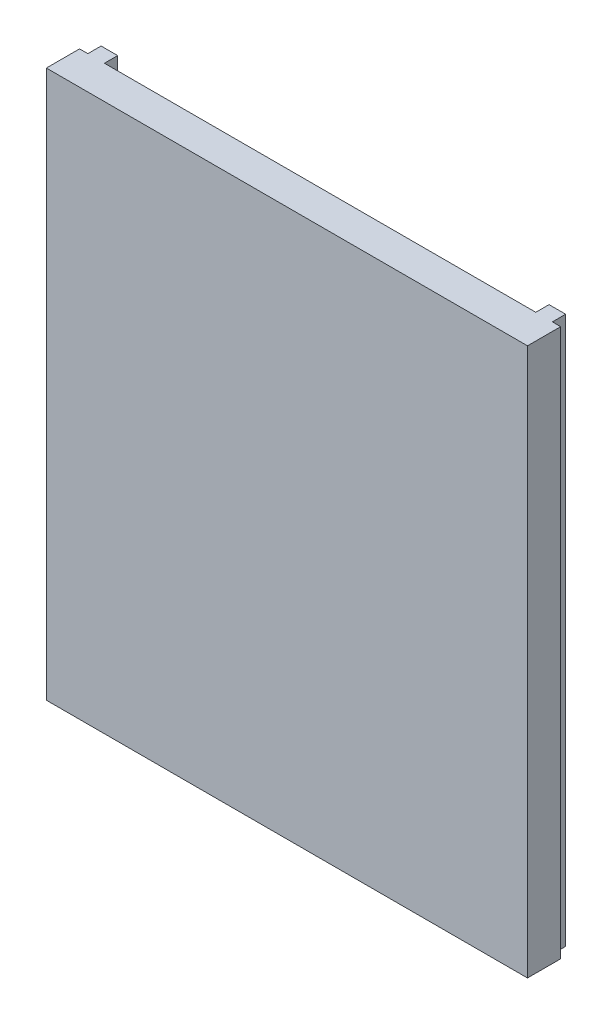
ISO-10303-21;
HEADER;
FILE_DESCRIPTION(('STEP AP214'),'2;1');
FILE_NAME('part.step','',(''),(''),'','','');
FILE_SCHEMA(('AUTOMOTIVE_DESIGN { 1 0 10303 214 1 1 1 1 }'));
ENDSEC;
DATA;
#1=APPLICATION_CONTEXT('core data for automotive mechanical design processes');
#2=APPLICATION_PROTOCOL_DEFINITION('international standard','automotive_design',2000,#1);
#3=PRODUCT_CONTEXT('',#1,'mechanical');
#4=PRODUCT('Part','Part','',(#3));
#5=PRODUCT_RELATED_PRODUCT_CATEGORY('part','',(#4));
#6=PRODUCT_DEFINITION_FORMATION('','',#4);
#7=PRODUCT_DEFINITION_CONTEXT('part definition',#1,'design');
#8=PRODUCT_DEFINITION('design','',#6,#7);
#9=PRODUCT_DEFINITION_SHAPE('','',#8);
#10=(LENGTH_UNIT() NAMED_UNIT(*) SI_UNIT(.MILLI.,.METRE.));
#11=(NAMED_UNIT(*) PLANE_ANGLE_UNIT() SI_UNIT($,.RADIAN.));
#12=(NAMED_UNIT(*) SI_UNIT($,.STERADIAN.) SOLID_ANGLE_UNIT());
#13=UNCERTAINTY_MEASURE_WITH_UNIT(LENGTH_MEASURE(1.E-05),#10,'distance_accuracy_value','');
#14=(GEOMETRIC_REPRESENTATION_CONTEXT(3) GLOBAL_UNCERTAINTY_ASSIGNED_CONTEXT((#13)) GLOBAL_UNIT_ASSIGNED_CONTEXT((#10,
#11,#12)) REPRESENTATION_CONTEXT('',''));
#15=CARTESIAN_POINT('',(0.,0.,0.));
#16=DIRECTION('',(0.,0.,1.));
#17=DIRECTION('',(1.,0.,0.));
#18=AXIS2_PLACEMENT_3D('',#15,#16,#17);
#19=CARTESIAN_POINT('',(0.,0.,1.00000000000015));
#20=DIRECTION('',(0.,0.,-1.));
#21=DIRECTION('',(-1.,0.,0.));
#22=AXIS2_PLACEMENT_3D('',#19,#20,#21);
#23=PLANE('',#22);
#24=DIRECTION('',(0.,-1.,0.));
#25=VECTOR('',#24,1.);
#26=CARTESIAN_POINT('',(-13.,-16.5,1.00000000000015));
#27=LINE('',#26,#25);
#28=CARTESIAN_POINT('',(-13.,16.5,1.00000000000015));
#29=VERTEX_POINT('',#28);
#30=CARTESIAN_POINT('',(-13.,-16.5,1.00000000000015));
#31=VERTEX_POINT('',#30);
#32=EDGE_CURVE('E61',#29,#31,#27,.T.);
#33=ORIENTED_EDGE('',*,*,#32,.F.);
#34=DIRECTION('',(-1.,0.,0.));
#35=VECTOR('',#34,1.);
#36=CARTESIAN_POINT('',(14.5,16.5,1.00000000000015));
#37=LINE('',#36,#35);
#38=CARTESIAN_POINT('',(13.,16.5,1.00000000000015));
#39=VERTEX_POINT('',#38);
#40=EDGE_CURVE('E65',#39,#29,#37,.T.);
#41=ORIENTED_EDGE('',*,*,#40,.F.);
#42=DIRECTION('',(0.,1.,0.));
#43=VECTOR('',#42,1.);
#44=CARTESIAN_POINT('',(13.,16.5,1.00000000000015));
#45=LINE('',#44,#43);
#46=CARTESIAN_POINT('',(13.,-16.5,1.00000000000015));
#47=VERTEX_POINT('',#46);
#48=EDGE_CURVE('E191',#47,#39,#45,.T.);
#49=ORIENTED_EDGE('',*,*,#48,.F.);
#50=DIRECTION('',(1.,0.,0.));
#51=VECTOR('',#50,1.);
#52=CARTESIAN_POINT('',(14.5,-16.5,1.00000000000015));
#53=LINE('',#52,#51);
#54=EDGE_CURVE('E232',#31,#47,#53,.T.);
#55=ORIENTED_EDGE('',*,*,#54,.F.);
#56=EDGE_LOOP('',(#33,#41,#49,#55));
#57=FACE_BOUND('',#56,.T.);
#58=ADVANCED_FACE('F45',(#57),#23,.T.);
#59=DIRECTION('',(0.,1.,0.));
#60=VECTOR('',#59,1.);
#61=CARTESIAN_POINT('',(-14.,-16.5,1.00000000000015));
#62=LINE('',#61,#60);
#63=CARTESIAN_POINT('',(-14.,-16.5,1.00000000000015));
#64=VERTEX_POINT('',#63);
#65=CARTESIAN_POINT('',(-14.,16.5,1.00000000000015));
#66=VERTEX_POINT('',#65);
#67=EDGE_CURVE('E156',#64,#66,#62,.T.);
#68=ORIENTED_EDGE('',*,*,#67,.F.);
#69=CARTESIAN_POINT('',(-14.5,-16.5,1.00000000000015));
#70=VERTEX_POINT('',#69);
#71=EDGE_CURVE('E212',#70,#64,#53,.T.);
#72=ORIENTED_EDGE('',*,*,#71,.F.);
#73=DIRECTION('',(0.,-1.,0.));
#74=VECTOR('',#73,1.);
#75=CARTESIAN_POINT('',(-14.5,16.5,1.00000000000015));
#76=LINE('',#75,#74);
#77=CARTESIAN_POINT('',(-14.5,16.5,1.00000000000015));
#78=VERTEX_POINT('',#77);
#79=EDGE_CURVE('E226',#78,#70,#76,.T.);
#80=ORIENTED_EDGE('',*,*,#79,.F.);
#81=EDGE_CURVE('E165',#66,#78,#37,.T.);
#82=ORIENTED_EDGE('',*,*,#81,.F.);
#83=EDGE_LOOP('',(#68,#72,#80,#82));
#84=FACE_BOUND('',#83,.T.);
#85=ADVANCED_FACE('F250',(#84),#23,.T.);
#86=CARTESIAN_POINT('',(14.5,16.5,3.00000000000015));
#87=DIRECTION('',(-1.,0.,0.));
#88=DIRECTION('',(0.,0.,1.));
#89=AXIS2_PLACEMENT_3D('',#86,#87,#88);
#90=PLANE('',#89);
#91=DIRECTION('',(0.,1.,0.));
#92=VECTOR('',#91,1.);
#93=CARTESIAN_POINT('',(14.5,16.5,1.00000000000015));
#94=LINE('',#93,#92);
#95=CARTESIAN_POINT('',(14.5,-16.5,1.00000000000015));
#96=VERTEX_POINT('',#95);
#97=CARTESIAN_POINT('',(14.5,16.5,1.00000000000015));
#98=VERTEX_POINT('',#97);
#99=EDGE_CURVE('E160',#96,#98,#94,.T.);
#100=ORIENTED_EDGE('',*,*,#99,.T.);
#101=DIRECTION('',(0.,0.,-1.));
#102=VECTOR('',#101,1.);
#103=CARTESIAN_POINT('',(14.5,16.5,3.00000000000015));
#104=LINE('',#103,#102);
#105=CARTESIAN_POINT('',(14.5,16.5,3.00000000000015));
#106=VERTEX_POINT('',#105);
#107=EDGE_CURVE('E11',#106,#98,#104,.T.);
#108=ORIENTED_EDGE('',*,*,#107,.F.);
#109=DIRECTION('',(0.,1.,0.));
#110=VECTOR('',#109,1.);
#111=CARTESIAN_POINT('',(14.5,16.5,3.00000000000015));
#112=LINE('',#111,#110);
#113=CARTESIAN_POINT('',(14.5,-16.5,3.00000000000015));
#114=VERTEX_POINT('',#113);
#115=EDGE_CURVE('E207',#114,#106,#112,.T.);
#116=ORIENTED_EDGE('',*,*,#115,.F.);
#117=DIRECTION('',(0.,0.,-1.));
#118=VECTOR('',#117,1.);
#119=CARTESIAN_POINT('',(14.5,-16.5,3.00000000000015));
#120=LINE('',#119,#118);
#121=EDGE_CURVE('E220',#114,#96,#120,.T.);
#122=ORIENTED_EDGE('',*,*,#121,.T.);
#123=EDGE_LOOP('',(#100,#108,#116,#122));
#124=FACE_BOUND('',#123,.T.);
#125=ADVANCED_FACE('F47',(#124),#90,.F.);
#126=CARTESIAN_POINT('',(14.5,16.5,3.00000000000015));
#127=DIRECTION('',(0.,-1.,0.));
#128=DIRECTION('',(0.,0.,-1.));
#129=AXIS2_PLACEMENT_3D('',#126,#127,#128);
#130=PLANE('',#129);
#131=CARTESIAN_POINT('',(14.,16.5,1.00000000000015));
#132=VERTEX_POINT('',#131);
#133=EDGE_CURVE('E222',#98,#132,#37,.T.);
#134=ORIENTED_EDGE('',*,*,#133,.T.);
#135=DIRECTION('',(0.,0.,1.));
#136=VECTOR('',#135,1.);
#137=CARTESIAN_POINT('',(14.,16.5,0.20000000000015));
#138=LINE('',#137,#136);
#139=CARTESIAN_POINT('',(14.,16.5,0.20000000000015));
#140=VERTEX_POINT('',#139);
#141=EDGE_CURVE('E174',#140,#132,#138,.T.);
#142=ORIENTED_EDGE('',*,*,#141,.F.);
#143=DIRECTION('',(1.,0.,0.));
#144=VECTOR('',#143,1.);
#145=CARTESIAN_POINT('',(13.,16.5,0.20000000000015));
#146=LINE('',#145,#144);
#147=CARTESIAN_POINT('',(13.,16.5,0.20000000000015));
#148=VERTEX_POINT('',#147);
#149=EDGE_CURVE('E201',#148,#140,#146,.T.);
#150=ORIENTED_EDGE('',*,*,#149,.F.);
#151=DIRECTION('',(0.,0.,1.));
#152=VECTOR('',#151,1.);
#153=CARTESIAN_POINT('',(13.,16.5,0.20000000000015));
#154=LINE('',#153,#152);
#155=EDGE_CURVE('E171',#148,#39,#154,.T.);
#156=ORIENTED_EDGE('',*,*,#155,.T.);
#157=ORIENTED_EDGE('',*,*,#40,.T.);
#158=DIRECTION('',(0.,0.,1.));
#159=VECTOR('',#158,1.);
#160=CARTESIAN_POINT('',(-13.,16.5,0.20000000000015));
#161=LINE('',#160,#159);
#162=CARTESIAN_POINT('',(-13.,16.5,0.20000000000015));
#163=VERTEX_POINT('',#162);
#164=EDGE_CURVE('E260',#163,#29,#161,.T.);
#165=ORIENTED_EDGE('',*,*,#164,.F.);
#166=DIRECTION('',(1.,0.,0.));
#167=VECTOR('',#166,1.);
#168=CARTESIAN_POINT('',(-13.,16.5,0.20000000000015));
#169=LINE('',#168,#167);
#170=CARTESIAN_POINT('',(-14.,16.5,0.20000000000015));
#171=VERTEX_POINT('',#170);
#172=EDGE_CURVE('E151',#171,#163,#169,.T.);
#173=ORIENTED_EDGE('',*,*,#172,.F.);
#174=DIRECTION('',(0.,0.,1.));
#175=VECTOR('',#174,1.);
#176=CARTESIAN_POINT('',(-14.,16.5,0.20000000000015));
#177=LINE('',#176,#175);
#178=EDGE_CURVE('E167',#171,#66,#177,.T.);
#179=ORIENTED_EDGE('',*,*,#178,.T.);
#180=ORIENTED_EDGE('',*,*,#81,.T.);
#181=DIRECTION('',(0.,0.,-1.));
#182=VECTOR('',#181,1.);
#183=CARTESIAN_POINT('',(-14.5,16.5,3.00000000000015));
#184=LINE('',#183,#182);
#185=CARTESIAN_POINT('',(-14.5,16.5,3.00000000000015));
#186=VERTEX_POINT('',#185);
#187=EDGE_CURVE('E54',#186,#78,#184,.T.);
#188=ORIENTED_EDGE('',*,*,#187,.F.);
#189=DIRECTION('',(-1.,0.,0.));
#190=VECTOR('',#189,1.);
#191=CARTESIAN_POINT('',(14.5,16.5,3.00000000000015));
#192=LINE('',#191,#190);
#193=EDGE_CURVE('E211',#106,#186,#192,.T.);
#194=ORIENTED_EDGE('',*,*,#193,.F.);
#195=ORIENTED_EDGE('',*,*,#107,.T.);
#196=EDGE_LOOP('',(#134,#142,#150,#156,#157,#165,#173,#179,#180,#188,#194,#195));
#197=FACE_BOUND('',#196,.T.);
#198=ADVANCED_FACE('F269',(#197),#130,.F.);
#199=CARTESIAN_POINT('',(-14.5,16.5,3.00000000000015));
#200=DIRECTION('',(1.,0.,0.));
#201=DIRECTION('',(0.,0.,-1.));
#202=AXIS2_PLACEMENT_3D('',#199,#200,#201);
#203=PLANE('',#202);
#204=ORIENTED_EDGE('',*,*,#79,.T.);
#205=DIRECTION('',(0.,0.,-1.));
#206=VECTOR('',#205,1.);
#207=CARTESIAN_POINT('',(-14.5,-16.5,3.00000000000015));
#208=LINE('',#207,#206);
#209=CARTESIAN_POINT('',(-14.5,-16.5,3.00000000000015));
#210=VERTEX_POINT('',#209);
#211=EDGE_CURVE('E236',#210,#70,#208,.T.);
#212=ORIENTED_EDGE('',*,*,#211,.F.);
#213=DIRECTION('',(0.,-1.,0.));
#214=VECTOR('',#213,1.);
#215=CARTESIAN_POINT('',(-14.5,16.5,3.00000000000015));
#216=LINE('',#215,#214);
#217=EDGE_CURVE('E215',#186,#210,#216,.T.);
#218=ORIENTED_EDGE('',*,*,#217,.F.);
#219=ORIENTED_EDGE('',*,*,#187,.T.);
#220=EDGE_LOOP('',(#204,#212,#218,#219));
#221=FACE_BOUND('',#220,.T.);
#222=ADVANCED_FACE('F245',(#221),#203,.F.);
#223=CARTESIAN_POINT('',(14.5,-16.5,3.00000000000015));
#224=DIRECTION('',(0.,1.,0.));
#225=DIRECTION('',(0.,0.,1.));
#226=AXIS2_PLACEMENT_3D('',#223,#224,#225);
#227=PLANE('',#226);
#228=ORIENTED_EDGE('',*,*,#71,.T.);
#229=DIRECTION('',(0.,0.,1.));
#230=VECTOR('',#229,1.);
#231=CARTESIAN_POINT('',(-14.,-16.5,0.20000000000015));
#232=LINE('',#231,#230);
#233=CARTESIAN_POINT('',(-14.,-16.5,0.20000000000015));
#234=VERTEX_POINT('',#233);
#235=EDGE_CURVE('E141',#234,#64,#232,.T.);
#236=ORIENTED_EDGE('',*,*,#235,.F.);
#237=DIRECTION('',(-1.,0.,0.));
#238=VECTOR('',#237,1.);
#239=CARTESIAN_POINT('',(-13.,-16.5,0.20000000000015));
#240=LINE('',#239,#238);
#241=CARTESIAN_POINT('',(-13.,-16.5,0.20000000000015));
#242=VERTEX_POINT('',#241);
#243=EDGE_CURVE('E133',#242,#234,#240,.T.);
#244=ORIENTED_EDGE('',*,*,#243,.F.);
#245=DIRECTION('',(0.,0.,1.));
#246=VECTOR('',#245,1.);
#247=CARTESIAN_POINT('',(-13.,-16.5,0.20000000000015));
#248=LINE('',#247,#246);
#249=EDGE_CURVE('E139',#242,#31,#248,.T.);
#250=ORIENTED_EDGE('',*,*,#249,.T.);
#251=ORIENTED_EDGE('',*,*,#54,.T.);
#252=DIRECTION('',(0.,0.,1.));
#253=VECTOR('',#252,1.);
#254=CARTESIAN_POINT('',(13.,-16.5,0.20000000000015));
#255=LINE('',#254,#253);
#256=CARTESIAN_POINT('',(13.,-16.5,0.20000000000015));
#257=VERTEX_POINT('',#256);
#258=EDGE_CURVE('E182',#257,#47,#255,.T.);
#259=ORIENTED_EDGE('',*,*,#258,.F.);
#260=DIRECTION('',(-1.,0.,0.));
#261=VECTOR('',#260,1.);
#262=CARTESIAN_POINT('',(13.,-16.5,0.20000000000015));
#263=LINE('',#262,#261);
#264=CARTESIAN_POINT('',(14.,-16.5,0.20000000000015));
#265=VERTEX_POINT('',#264);
#266=EDGE_CURVE('E186',#265,#257,#263,.T.);
#267=ORIENTED_EDGE('',*,*,#266,.F.);
#268=DIRECTION('',(0.,0.,1.));
#269=VECTOR('',#268,1.);
#270=CARTESIAN_POINT('',(14.,-16.5,0.20000000000015));
#271=LINE('',#270,#269);
#272=CARTESIAN_POINT('',(14.,-16.5,1.00000000000015));
#273=VERTEX_POINT('',#272);
#274=EDGE_CURVE('E178',#265,#273,#271,.T.);
#275=ORIENTED_EDGE('',*,*,#274,.T.);
#276=EDGE_CURVE('E229',#273,#96,#53,.T.);
#277=ORIENTED_EDGE('',*,*,#276,.T.);
#278=ORIENTED_EDGE('',*,*,#121,.F.);
#279=DIRECTION('',(1.,0.,0.));
#280=VECTOR('',#279,1.);
#281=CARTESIAN_POINT('',(14.5,-16.5,3.00000000000015));
#282=LINE('',#281,#280);
#283=EDGE_CURVE('E218',#210,#114,#282,.T.);
#284=ORIENTED_EDGE('',*,*,#283,.F.);
#285=ORIENTED_EDGE('',*,*,#211,.T.);
#286=EDGE_LOOP('',(#228,#236,#244,#250,#251,#259,#267,#275,#277,#278,#284,#285));
#287=FACE_BOUND('',#286,.T.);
#288=ADVANCED_FACE('F136',(#287),#227,.F.);
#289=CARTESIAN_POINT('',(0.,0.,3.00000000000015));
#290=DIRECTION('',(0.,0.,-1.));
#291=DIRECTION('',(-1.,0.,0.));
#292=AXIS2_PLACEMENT_3D('',#289,#290,#291);
#293=PLANE('',#292);
#294=ORIENTED_EDGE('',*,*,#115,.T.);
#295=ORIENTED_EDGE('',*,*,#193,.T.);
#296=ORIENTED_EDGE('',*,*,#217,.T.);
#297=ORIENTED_EDGE('',*,*,#283,.T.);
#298=EDGE_LOOP('',(#294,#295,#296,#297));
#299=FACE_BOUND('',#298,.T.);
#300=ADVANCED_FACE('F295',(#299),#293,.F.);
#301=DIRECTION('',(0.,-1.,0.));
#302=VECTOR('',#301,1.);
#303=CARTESIAN_POINT('',(14.,16.5,1.00000000000015));
#304=LINE('',#303,#302);
#305=EDGE_CURVE('E187',#132,#273,#304,.T.);
#306=ORIENTED_EDGE('',*,*,#305,.F.);
#307=ORIENTED_EDGE('',*,*,#133,.F.);
#308=ORIENTED_EDGE('',*,*,#99,.F.);
#309=ORIENTED_EDGE('',*,*,#276,.F.);
#310=EDGE_LOOP('',(#306,#307,#308,#309));
#311=FACE_BOUND('',#310,.T.);
#312=ADVANCED_FACE('F289',(#311),#23,.T.);
#313=CARTESIAN_POINT('',(13.,16.5,0.20000000000015));
#314=DIRECTION('',(1.,0.,0.));
#315=DIRECTION('',(0.,0.,-1.));
#316=AXIS2_PLACEMENT_3D('',#313,#314,#315);
#317=PLANE('',#316);
#318=ORIENTED_EDGE('',*,*,#48,.T.);
#319=ORIENTED_EDGE('',*,*,#155,.F.);
#320=DIRECTION('',(0.,1.,0.));
#321=VECTOR('',#320,1.);
#322=CARTESIAN_POINT('',(13.,16.5,0.20000000000015));
#323=LINE('',#322,#321);
#324=EDGE_CURVE('E192',#257,#148,#323,.T.);
#325=ORIENTED_EDGE('',*,*,#324,.F.);
#326=ORIENTED_EDGE('',*,*,#258,.T.);
#327=EDGE_LOOP('',(#318,#319,#325,#326));
#328=FACE_BOUND('',#327,.T.);
#329=ADVANCED_FACE('F279',(#328),#317,.F.);
#330=CARTESIAN_POINT('',(14.,16.5,0.20000000000015));
#331=DIRECTION('',(-1.,0.,0.));
#332=DIRECTION('',(0.,0.,1.));
#333=AXIS2_PLACEMENT_3D('',#330,#331,#332);
#334=PLANE('',#333);
#335=ORIENTED_EDGE('',*,*,#305,.T.);
#336=ORIENTED_EDGE('',*,*,#274,.F.);
#337=DIRECTION('',(0.,-1.,0.));
#338=VECTOR('',#337,1.);
#339=CARTESIAN_POINT('',(14.,16.5,0.20000000000015));
#340=LINE('',#339,#338);
#341=EDGE_CURVE('E198',#140,#265,#340,.T.);
#342=ORIENTED_EDGE('',*,*,#341,.F.);
#343=ORIENTED_EDGE('',*,*,#141,.T.);
#344=EDGE_LOOP('',(#335,#336,#342,#343));
#345=FACE_BOUND('',#344,.T.);
#346=ADVANCED_FACE('F287',(#345),#334,.F.);
#347=CARTESIAN_POINT('',(0.,0.,0.20000000000015));
#348=DIRECTION('',(0.,0.,1.));
#349=DIRECTION('',(1.,0.,0.));
#350=AXIS2_PLACEMENT_3D('',#347,#348,#349);
#351=PLANE('',#350);
#352=ORIENTED_EDGE('',*,*,#324,.T.);
#353=ORIENTED_EDGE('',*,*,#149,.T.);
#354=ORIENTED_EDGE('',*,*,#341,.T.);
#355=ORIENTED_EDGE('',*,*,#266,.T.);
#356=EDGE_LOOP('',(#352,#353,#354,#355));
#357=FACE_BOUND('',#356,.T.);
#358=ADVANCED_FACE('F281',(#357),#351,.F.);
#359=CARTESIAN_POINT('',(-13.,-16.5,0.20000000000015));
#360=DIRECTION('',(-1.,0.,0.));
#361=DIRECTION('',(0.,0.,1.));
#362=AXIS2_PLACEMENT_3D('',#359,#360,#361);
#363=PLANE('',#362);
#364=ORIENTED_EDGE('',*,*,#32,.T.);
#365=ORIENTED_EDGE('',*,*,#249,.F.);
#366=DIRECTION('',(0.,-1.,0.));
#367=VECTOR('',#366,1.);
#368=CARTESIAN_POINT('',(-13.,-16.5,0.20000000000015));
#369=LINE('',#368,#367);
#370=EDGE_CURVE('E146',#163,#242,#369,.T.);
#371=ORIENTED_EDGE('',*,*,#370,.F.);
#372=ORIENTED_EDGE('',*,*,#164,.T.);
#373=EDGE_LOOP('',(#364,#365,#371,#372));
#374=FACE_BOUND('',#373,.T.);
#375=ADVANCED_FACE('F158',(#374),#363,.F.);
#376=CARTESIAN_POINT('',(-14.,-16.5,0.20000000000015));
#377=DIRECTION('',(1.,0.,0.));
#378=DIRECTION('',(0.,0.,-1.));
#379=AXIS2_PLACEMENT_3D('',#376,#377,#378);
#380=PLANE('',#379);
#381=ORIENTED_EDGE('',*,*,#67,.T.);
#382=ORIENTED_EDGE('',*,*,#178,.F.);
#383=DIRECTION('',(0.,1.,0.));
#384=VECTOR('',#383,1.);
#385=CARTESIAN_POINT('',(-14.,-16.5,0.20000000000015));
#386=LINE('',#385,#384);
#387=EDGE_CURVE('E145',#234,#171,#386,.T.);
#388=ORIENTED_EDGE('',*,*,#387,.F.);
#389=ORIENTED_EDGE('',*,*,#235,.T.);
#390=EDGE_LOOP('',(#381,#382,#388,#389));
#391=FACE_BOUND('',#390,.T.);
#392=ADVANCED_FACE('F254',(#391),#380,.F.);
#393=CARTESIAN_POINT('',(0.,0.,0.20000000000015));
#394=DIRECTION('',(0.,0.,1.));
#395=DIRECTION('',(1.,0.,0.));
#396=AXIS2_PLACEMENT_3D('',#393,#394,#395);
#397=PLANE('',#396);
#398=ORIENTED_EDGE('',*,*,#370,.T.);
#399=ORIENTED_EDGE('',*,*,#243,.T.);
#400=ORIENTED_EDGE('',*,*,#387,.T.);
#401=ORIENTED_EDGE('',*,*,#172,.T.);
#402=EDGE_LOOP('',(#398,#399,#400,#401));
#403=FACE_BOUND('',#402,.T.);
#404=ADVANCED_FACE('F149',(#403),#397,.F.);
#405=CLOSED_SHELL('',(#58,#85,#125,#198,#222,#288,#300,#312,#329,#346,#358,#375,#392,#404));
#406=MANIFOLD_SOLID_BREP('B2',#405);
#407=ADVANCED_BREP_SHAPE_REPRESENTATION('',(#18,#406),#14);
#408=SHAPE_DEFINITION_REPRESENTATION(#9,#407);
ENDSEC;
END-ISO-10303-21;
